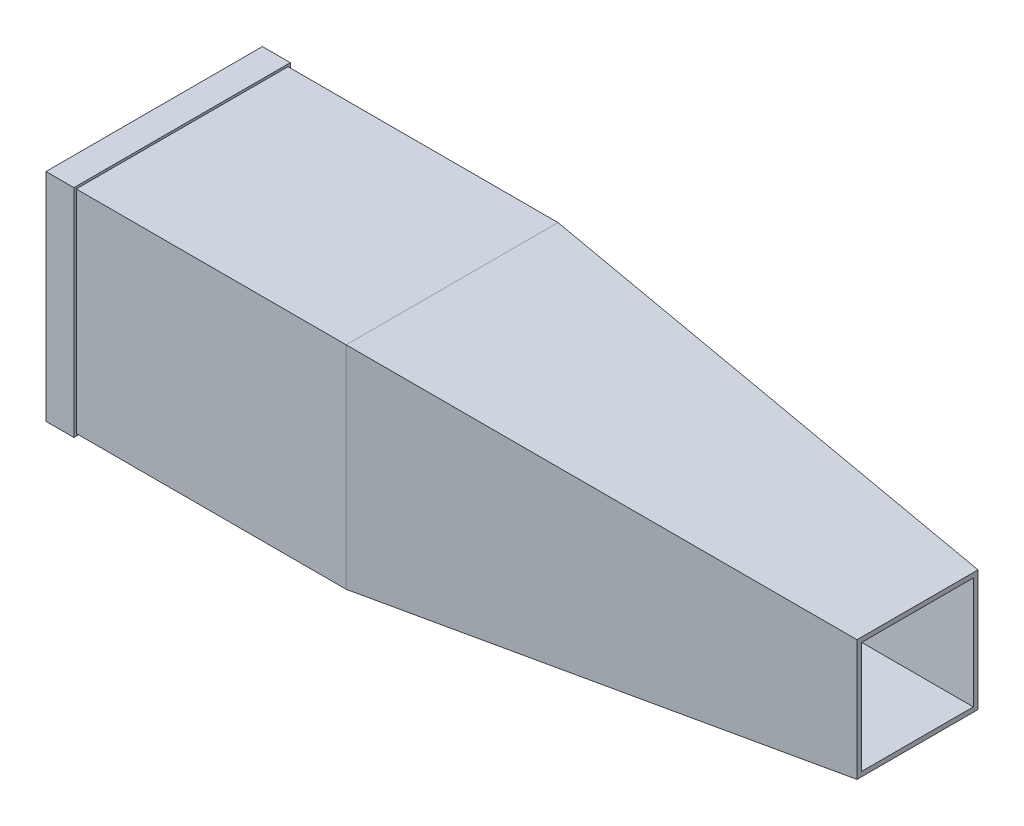
ISO-10303-21;
HEADER;
FILE_DESCRIPTION(('STEP AP214'),'2;1');
FILE_NAME('part.step','',(''),(''),'','','');
FILE_SCHEMA(('AUTOMOTIVE_DESIGN { 1 0 10303 214 1 1 1 1 }'));
ENDSEC;
DATA;
#1=APPLICATION_CONTEXT('core data for automotive mechanical design processes');
#2=APPLICATION_PROTOCOL_DEFINITION('international standard','automotive_design',2000,#1);
#3=PRODUCT_CONTEXT('',#1,'mechanical');
#4=PRODUCT('Part','Part','',(#3));
#5=PRODUCT_RELATED_PRODUCT_CATEGORY('part','',(#4));
#6=PRODUCT_DEFINITION_FORMATION('','',#4);
#7=PRODUCT_DEFINITION_CONTEXT('part definition',#1,'design');
#8=PRODUCT_DEFINITION('design','',#6,#7);
#9=PRODUCT_DEFINITION_SHAPE('','',#8);
#10=(LENGTH_UNIT() NAMED_UNIT(*) SI_UNIT(.MILLI.,.METRE.));
#11=(NAMED_UNIT(*) PLANE_ANGLE_UNIT() SI_UNIT($,.RADIAN.));
#12=(NAMED_UNIT(*) SI_UNIT($,.STERADIAN.) SOLID_ANGLE_UNIT());
#13=UNCERTAINTY_MEASURE_WITH_UNIT(LENGTH_MEASURE(1.E-05),#10,'distance_accuracy_value','');
#14=(GEOMETRIC_REPRESENTATION_CONTEXT(3) GLOBAL_UNCERTAINTY_ASSIGNED_CONTEXT((#13)) GLOBAL_UNIT_ASSIGNED_CONTEXT((#10,
#11,#12)) REPRESENTATION_CONTEXT('',''));
#15=CARTESIAN_POINT('',(0.,0.,0.));
#16=DIRECTION('',(0.,0.,1.));
#17=DIRECTION('',(1.,0.,0.));
#18=AXIS2_PLACEMENT_3D('',#15,#16,#17);
#19=CARTESIAN_POINT('',(320.,108.75,-108.75));
#20=DIRECTION('',(0.,0.,1.));
#21=DIRECTION('',(1.,0.,0.));
#22=AXIS2_PLACEMENT_3D('',#19,#20,#21);
#23=PLANE('',#22);
#24=DIRECTION('',(-1.,0.,0.));
#25=VECTOR('',#24,1.);
#26=CARTESIAN_POINT('',(320.,108.75,-108.75));
#27=LINE('',#26,#25);
#28=CARTESIAN_POINT('',(320.,108.75,-108.75));
#29=VERTEX_POINT('',#28);
#30=CARTESIAN_POINT('',(167.,108.75,-108.75));
#31=VERTEX_POINT('',#30);
#32=EDGE_CURVE('E334',#29,#31,#27,.T.);
#33=ORIENTED_EDGE('',*,*,#32,.T.);
#34=DIRECTION('',(0.,1.,0.));
#35=VECTOR('',#34,1.);
#36=CARTESIAN_POINT('',(167.,108.75,-108.75));
#37=LINE('',#36,#35);
#38=CARTESIAN_POINT('',(167.,-108.75,-108.75));
#39=VERTEX_POINT('',#38);
#40=EDGE_CURVE('E381',#39,#31,#37,.T.);
#41=ORIENTED_EDGE('',*,*,#40,.F.);
#42=DIRECTION('',(-1.,0.,0.));
#43=VECTOR('',#42,1.);
#44=CARTESIAN_POINT('',(320.,-108.75,-108.75));
#45=LINE('',#44,#43);
#46=CARTESIAN_POINT('',(320.,-108.75,-108.75));
#47=VERTEX_POINT('',#46);
#48=EDGE_CURVE('E275',#47,#39,#45,.T.);
#49=ORIENTED_EDGE('',*,*,#48,.F.);
#50=CARTESIAN_POINT('',(320.,-108.75,-108.75));
#51=DIRECTION('',(0.,1.,0.));
#52=VECTOR('',#51,1.);
#53=LINE('',#50,#52);
#54=EDGE_CURVE('E351',#47,#29,#53,.T.);
#55=ORIENTED_EDGE('',*,*,#54,.T.);
#56=EDGE_LOOP('',(#33,#41,#49,#55));
#57=FACE_BOUND('',#56,.T.);
#58=ADVANCED_FACE('F63',(#57),#23,.T.);
#59=CARTESIAN_POINT('',(320.,108.75,108.75));
#60=DIRECTION('',(0.,-1.,0.));
#61=DIRECTION('',(0.,0.,-1.));
#62=AXIS2_PLACEMENT_3D('',#59,#60,#61);
#63=PLANE('',#62);
#64=DIRECTION('',(-1.,0.,0.));
#65=VECTOR('',#64,1.);
#66=CARTESIAN_POINT('',(320.,108.75,108.75));
#67=LINE('',#66,#65);
#68=CARTESIAN_POINT('',(320.,108.75,108.75));
#69=VERTEX_POINT('',#68);
#70=CARTESIAN_POINT('',(167.,108.75,108.75));
#71=VERTEX_POINT('',#70);
#72=EDGE_CURVE('E724',#69,#71,#67,.T.);
#73=ORIENTED_EDGE('',*,*,#72,.T.);
#74=DIRECTION('',(0.,0.,1.));
#75=VECTOR('',#74,1.);
#76=CARTESIAN_POINT('',(167.,108.75,-108.75));
#77=LINE('',#76,#75);
#78=EDGE_CURVE('E384',#31,#71,#77,.T.);
#79=ORIENTED_EDGE('',*,*,#78,.F.);
#80=ORIENTED_EDGE('',*,*,#32,.F.);
#81=CARTESIAN_POINT('',(320.,108.75,-108.75));
#82=DIRECTION('',(0.,0.,1.));
#83=VECTOR('',#82,1.);
#84=LINE('',#81,#83);
#85=EDGE_CURVE('E905',#29,#69,#84,.T.);
#86=ORIENTED_EDGE('',*,*,#85,.T.);
#87=EDGE_LOOP('',(#73,#79,#80,#86));
#88=FACE_BOUND('',#87,.T.);
#89=ADVANCED_FACE('F324',(#88),#63,.T.);
#90=CARTESIAN_POINT('',(320.,108.75,108.75));
#91=DIRECTION('',(0.,0.,-1.));
#92=DIRECTION('',(-1.,0.,0.));
#93=AXIS2_PLACEMENT_3D('',#90,#91,#92);
#94=PLANE('',#93);
#95=DIRECTION('',(-1.,0.,0.));
#96=VECTOR('',#95,1.);
#97=CARTESIAN_POINT('',(320.,-108.75,108.75));
#98=LINE('',#97,#96);
#99=CARTESIAN_POINT('',(320.,-108.75,108.75));
#100=VERTEX_POINT('',#99);
#101=CARTESIAN_POINT('',(167.,-108.75,108.75));
#102=VERTEX_POINT('',#101);
#103=EDGE_CURVE('E274',#100,#102,#98,.T.);
#104=ORIENTED_EDGE('',*,*,#103,.T.);
#105=DIRECTION('',(0.,-1.,0.));
#106=VECTOR('',#105,1.);
#107=CARTESIAN_POINT('',(167.,108.75,108.75));
#108=LINE('',#107,#106);
#109=EDGE_CURVE('E90',#71,#102,#108,.T.);
#110=ORIENTED_EDGE('',*,*,#109,.F.);
#111=ORIENTED_EDGE('',*,*,#72,.F.);
#112=CARTESIAN_POINT('',(320.,108.75,108.75));
#113=DIRECTION('',(0.,-1.,0.));
#114=VECTOR('',#113,1.);
#115=LINE('',#112,#114);
#116=EDGE_CURVE('E299',#69,#100,#115,.T.);
#117=ORIENTED_EDGE('',*,*,#116,.T.);
#118=EDGE_LOOP('',(#104,#110,#111,#117));
#119=FACE_BOUND('',#118,.T.);
#120=ADVANCED_FACE('F316',(#119),#94,.T.);
#121=CARTESIAN_POINT('',(320.,-108.75,108.75));
#122=DIRECTION('',(0.,1.,0.));
#123=DIRECTION('',(0.,0.,1.));
#124=AXIS2_PLACEMENT_3D('',#121,#122,#123);
#125=PLANE('',#124);
#126=ORIENTED_EDGE('',*,*,#48,.T.);
#127=DIRECTION('',(0.,0.,-1.));
#128=VECTOR('',#127,1.);
#129=CARTESIAN_POINT('',(167.,-108.75,-108.75));
#130=LINE('',#129,#128);
#131=EDGE_CURVE('E385',#102,#39,#130,.T.);
#132=ORIENTED_EDGE('',*,*,#131,.F.);
#133=ORIENTED_EDGE('',*,*,#103,.F.);
#134=CARTESIAN_POINT('',(320.,-108.75,108.75));
#135=DIRECTION('',(0.,0.,-1.));
#136=VECTOR('',#135,1.);
#137=LINE('',#134,#136);
#138=EDGE_CURVE('E367',#100,#47,#137,.T.);
#139=ORIENTED_EDGE('',*,*,#138,.T.);
#140=EDGE_LOOP('',(#126,#132,#133,#139));
#141=FACE_BOUND('',#140,.T.);
#142=ADVANCED_FACE('F375',(#141),#125,.T.);
#143=CARTESIAN_POINT('',(30.,0.,0.));
#144=DIRECTION('',(1.,0.,0.));
#145=DIRECTION('',(0.,0.,-1.));
#146=AXIS2_PLACEMENT_3D('',#143,#144,#145);
#147=PLANE('',#146);
#148=DIRECTION('',(0.,1.,0.));
#149=VECTOR('',#148,1.);
#150=CARTESIAN_POINT('',(30.,116.25,-116.25));
#151=LINE('',#150,#149);
#152=CARTESIAN_POINT('',(30.,-116.25,-116.25));
#153=VERTEX_POINT('',#152);
#154=CARTESIAN_POINT('',(30.,116.25,-116.25));
#155=VERTEX_POINT('',#154);
#156=EDGE_CURVE('E639',#153,#155,#151,.T.);
#157=ORIENTED_EDGE('',*,*,#156,.T.);
#158=DIRECTION('',(0.,0.,1.));
#159=VECTOR('',#158,1.);
#160=CARTESIAN_POINT('',(30.,116.25,116.25));
#161=LINE('',#160,#159);
#162=CARTESIAN_POINT('',(30.,116.25,116.25));
#163=VERTEX_POINT('',#162);
#164=EDGE_CURVE('E643',#155,#163,#161,.T.);
#165=ORIENTED_EDGE('',*,*,#164,.T.);
#166=DIRECTION('',(0.,-1.,0.));
#167=VECTOR('',#166,1.);
#168=CARTESIAN_POINT('',(30.,116.25,116.25));
#169=LINE('',#168,#167);
#170=CARTESIAN_POINT('',(30.,-116.25,116.25));
#171=VERTEX_POINT('',#170);
#172=EDGE_CURVE('E647',#163,#171,#169,.T.);
#173=ORIENTED_EDGE('',*,*,#172,.T.);
#174=DIRECTION('',(0.,0.,-1.));
#175=VECTOR('',#174,1.);
#176=CARTESIAN_POINT('',(30.,-116.25,116.25));
#177=LINE('',#176,#175);
#178=EDGE_CURVE('E650',#171,#153,#177,.T.);
#179=ORIENTED_EDGE('',*,*,#178,.T.);
#180=EDGE_LOOP('',(#157,#165,#173,#179));
#181=FACE_BOUND('',#180,.T.);
#182=DIRECTION('',(0.,0.,-1.));
#183=VECTOR('',#182,1.);
#184=CARTESIAN_POINT('',(30.,113.75,0.));
#185=LINE('',#184,#183);
#186=CARTESIAN_POINT('',(30.,113.75,113.75));
#187=VERTEX_POINT('',#186);
#188=CARTESIAN_POINT('',(30.,113.75,-113.75));
#189=VERTEX_POINT('',#188);
#190=EDGE_CURVE('E74',#187,#189,#185,.T.);
#191=ORIENTED_EDGE('',*,*,#190,.T.);
#192=DIRECTION('',(0.,-1.,0.));
#193=VECTOR('',#192,1.);
#194=CARTESIAN_POINT('',(30.,0.,-113.75));
#195=LINE('',#194,#193);
#196=CARTESIAN_POINT('',(30.,-113.75,-113.75));
#197=VERTEX_POINT('',#196);
#198=EDGE_CURVE('E12',#189,#197,#195,.T.);
#199=ORIENTED_EDGE('',*,*,#198,.T.);
#200=DIRECTION('',(0.,0.,1.));
#201=VECTOR('',#200,1.);
#202=CARTESIAN_POINT('',(30.,-113.75,0.));
#203=LINE('',#202,#201);
#204=CARTESIAN_POINT('',(30.,-113.75,113.75));
#205=VERTEX_POINT('',#204);
#206=EDGE_CURVE('E684',#197,#205,#203,.T.);
#207=ORIENTED_EDGE('',*,*,#206,.T.);
#208=DIRECTION('',(0.,1.,0.));
#209=VECTOR('',#208,1.);
#210=CARTESIAN_POINT('',(30.,0.,113.75));
#211=LINE('',#210,#209);
#212=EDGE_CURVE('E688',#205,#187,#211,.T.);
#213=ORIENTED_EDGE('',*,*,#212,.T.);
#214=EDGE_LOOP('',(#191,#199,#207,#213));
#215=FACE_BOUND('',#214,.T.);
#216=ADVANCED_FACE('F834',(#181,#215),#147,.T.);
#217=CARTESIAN_POINT('',(0.,0.,0.));
#218=DIRECTION('',(1.,0.,0.));
#219=DIRECTION('',(0.,0.,-1.));
#220=AXIS2_PLACEMENT_3D('',#217,#218,#219);
#221=PLANE('',#220);
#222=DIRECTION('',(0.,1.,0.));
#223=VECTOR('',#222,1.);
#224=CARTESIAN_POINT('',(0.,116.25,-116.25));
#225=LINE('',#224,#223);
#226=CARTESIAN_POINT('',(0.,-116.25,-116.25));
#227=VERTEX_POINT('',#226);
#228=CARTESIAN_POINT('',(0.,116.25,-116.25));
#229=VERTEX_POINT('',#228);
#230=EDGE_CURVE('E638',#227,#229,#225,.T.);
#231=ORIENTED_EDGE('',*,*,#230,.F.);
#232=DIRECTION('',(0.,0.,-1.));
#233=VECTOR('',#232,1.);
#234=CARTESIAN_POINT('',(0.,-116.25,116.25));
#235=LINE('',#234,#233);
#236=CARTESIAN_POINT('',(0.,-116.25,116.25));
#237=VERTEX_POINT('',#236);
#238=EDGE_CURVE('E644',#237,#227,#235,.T.);
#239=ORIENTED_EDGE('',*,*,#238,.F.);
#240=DIRECTION('',(0.,-1.,0.));
#241=VECTOR('',#240,1.);
#242=CARTESIAN_POINT('',(0.,116.25,116.25));
#243=LINE('',#242,#241);
#244=CARTESIAN_POINT('',(0.,116.25,116.25));
#245=VERTEX_POINT('',#244);
#246=EDGE_CURVE('E660',#245,#237,#243,.T.);
#247=ORIENTED_EDGE('',*,*,#246,.F.);
#248=DIRECTION('',(0.,0.,1.));
#249=VECTOR('',#248,1.);
#250=CARTESIAN_POINT('',(0.,116.25,116.25));
#251=LINE('',#250,#249);
#252=EDGE_CURVE('E657',#229,#245,#251,.T.);
#253=ORIENTED_EDGE('',*,*,#252,.F.);
#254=EDGE_LOOP('',(#231,#239,#247,#253));
#255=FACE_BOUND('',#254,.T.);
#256=DIRECTION('',(0.,1.,0.));
#257=VECTOR('',#256,1.);
#258=CARTESIAN_POINT('',(0.,111.25,-111.25));
#259=LINE('',#258,#257);
#260=CARTESIAN_POINT('',(0.,-111.25,-111.25));
#261=VERTEX_POINT('',#260);
#262=CARTESIAN_POINT('',(0.,111.25,-111.25));
#263=VERTEX_POINT('',#262);
#264=EDGE_CURVE('E610',#261,#263,#259,.T.);
#265=ORIENTED_EDGE('',*,*,#264,.T.);
#266=DIRECTION('',(0.,0.,1.));
#267=VECTOR('',#266,1.);
#268=CARTESIAN_POINT('',(0.,111.25,111.25));
#269=LINE('',#268,#267);
#270=CARTESIAN_POINT('',(0.,111.25,111.25));
#271=VERTEX_POINT('',#270);
#272=EDGE_CURVE('E614',#263,#271,#269,.T.);
#273=ORIENTED_EDGE('',*,*,#272,.T.);
#274=DIRECTION('',(0.,-1.,0.));
#275=VECTOR('',#274,1.);
#276=CARTESIAN_POINT('',(0.,111.25,111.25));
#277=LINE('',#276,#275);
#278=CARTESIAN_POINT('',(0.,-111.25,111.25));
#279=VERTEX_POINT('',#278);
#280=EDGE_CURVE('E618',#271,#279,#277,.T.);
#281=ORIENTED_EDGE('',*,*,#280,.T.);
#282=DIRECTION('',(0.,0.,-1.));
#283=VECTOR('',#282,1.);
#284=CARTESIAN_POINT('',(0.,-111.25,111.25));
#285=LINE('',#284,#283);
#286=EDGE_CURVE('E622',#279,#261,#285,.T.);
#287=ORIENTED_EDGE('',*,*,#286,.T.);
#288=EDGE_LOOP('',(#265,#273,#281,#287));
#289=FACE_BOUND('',#288,.T.);
#290=ADVANCED_FACE('F837',(#255,#289),#221,.F.);
#291=CARTESIAN_POINT('',(30.,116.25,-116.25));
#292=DIRECTION('',(0.,0.,1.));
#293=DIRECTION('',(1.,0.,0.));
#294=AXIS2_PLACEMENT_3D('',#291,#292,#293);
#295=PLANE('',#294);
#296=ORIENTED_EDGE('',*,*,#230,.T.);
#297=DIRECTION('',(-1.,0.,0.));
#298=VECTOR('',#297,1.);
#299=CARTESIAN_POINT('',(30.,116.25,-116.25));
#300=LINE('',#299,#298);
#301=EDGE_CURVE('E676',#155,#229,#300,.T.);
#302=ORIENTED_EDGE('',*,*,#301,.F.);
#303=ORIENTED_EDGE('',*,*,#156,.F.);
#304=DIRECTION('',(-1.,0.,0.));
#305=VECTOR('',#304,1.);
#306=CARTESIAN_POINT('',(30.,-116.25,-116.25));
#307=LINE('',#306,#305);
#308=EDGE_CURVE('E653',#153,#227,#307,.T.);
#309=ORIENTED_EDGE('',*,*,#308,.T.);
#310=EDGE_LOOP('',(#296,#302,#303,#309));
#311=FACE_BOUND('',#310,.T.);
#312=ADVANCED_FACE('F65',(#311),#295,.F.);
#313=CARTESIAN_POINT('',(30.,116.25,116.25));
#314=DIRECTION('',(0.,-1.,0.));
#315=DIRECTION('',(0.,0.,-1.));
#316=AXIS2_PLACEMENT_3D('',#313,#314,#315);
#317=PLANE('',#316);
#318=ORIENTED_EDGE('',*,*,#252,.T.);
#319=DIRECTION('',(-1.,0.,0.));
#320=VECTOR('',#319,1.);
#321=CARTESIAN_POINT('',(30.,116.25,116.25));
#322=LINE('',#321,#320);
#323=EDGE_CURVE('E672',#163,#245,#322,.T.);
#324=ORIENTED_EDGE('',*,*,#323,.F.);
#325=ORIENTED_EDGE('',*,*,#164,.F.);
#326=ORIENTED_EDGE('',*,*,#301,.T.);
#327=EDGE_LOOP('',(#318,#324,#325,#326));
#328=FACE_BOUND('',#327,.T.);
#329=ADVANCED_FACE('F847',(#328),#317,.F.);
#330=CARTESIAN_POINT('',(30.,116.25,116.25));
#331=DIRECTION('',(0.,0.,-1.));
#332=DIRECTION('',(-1.,0.,0.));
#333=AXIS2_PLACEMENT_3D('',#330,#331,#332);
#334=PLANE('',#333);
#335=ORIENTED_EDGE('',*,*,#246,.T.);
#336=DIRECTION('',(-1.,0.,0.));
#337=VECTOR('',#336,1.);
#338=CARTESIAN_POINT('',(30.,-116.25,116.25));
#339=LINE('',#338,#337);
#340=EDGE_CURVE('E668',#171,#237,#339,.T.);
#341=ORIENTED_EDGE('',*,*,#340,.F.);
#342=ORIENTED_EDGE('',*,*,#172,.F.);
#343=ORIENTED_EDGE('',*,*,#323,.T.);
#344=EDGE_LOOP('',(#335,#341,#342,#343));
#345=FACE_BOUND('',#344,.T.);
#346=ADVANCED_FACE('F844',(#345),#334,.F.);
#347=CARTESIAN_POINT('',(30.,-116.25,116.25));
#348=DIRECTION('',(0.,1.,0.));
#349=DIRECTION('',(0.,0.,1.));
#350=AXIS2_PLACEMENT_3D('',#347,#348,#349);
#351=PLANE('',#350);
#352=ORIENTED_EDGE('',*,*,#238,.T.);
#353=ORIENTED_EDGE('',*,*,#308,.F.);
#354=ORIENTED_EDGE('',*,*,#178,.F.);
#355=ORIENTED_EDGE('',*,*,#340,.T.);
#356=EDGE_LOOP('',(#352,#353,#354,#355));
#357=FACE_BOUND('',#356,.T.);
#358=ADVANCED_FACE('F832',(#357),#351,.F.);
#359=CARTESIAN_POINT('',(30.,111.25,-111.25));
#360=DIRECTION('',(0.,0.,1.));
#361=DIRECTION('',(1.,0.,0.));
#362=AXIS2_PLACEMENT_3D('',#359,#360,#361);
#363=PLANE('',#362);
#364=DIRECTION('',(0.,-1.,0.));
#365=VECTOR('',#364,1.);
#366=CARTESIAN_POINT('',(20.,111.25,-111.25));
#367=LINE('',#366,#365);
#368=CARTESIAN_POINT('',(20.,111.25,-111.25));
#369=VERTEX_POINT('',#368);
#370=CARTESIAN_POINT('',(20.,-111.25,-111.25));
#371=VERTEX_POINT('',#370);
#372=EDGE_CURVE('E606',#369,#371,#367,.T.);
#373=ORIENTED_EDGE('',*,*,#372,.F.);
#374=DIRECTION('',(-1.,0.,0.));
#375=VECTOR('',#374,1.);
#376=CARTESIAN_POINT('',(30.,111.25,-111.25));
#377=LINE('',#376,#375);
#378=EDGE_CURVE('E635',#369,#263,#377,.T.);
#379=ORIENTED_EDGE('',*,*,#378,.T.);
#380=ORIENTED_EDGE('',*,*,#264,.F.);
#381=DIRECTION('',(-1.,0.,0.));
#382=VECTOR('',#381,1.);
#383=CARTESIAN_POINT('',(30.,-111.25,-111.25));
#384=LINE('',#383,#382);
#385=EDGE_CURVE('E626',#371,#261,#384,.T.);
#386=ORIENTED_EDGE('',*,*,#385,.F.);
#387=EDGE_LOOP('',(#373,#379,#380,#386));
#388=FACE_BOUND('',#387,.T.);
#389=ADVANCED_FACE('F828',(#388),#363,.T.);
#390=CARTESIAN_POINT('',(30.,111.25,111.25));
#391=DIRECTION('',(0.,-1.,0.));
#392=DIRECTION('',(0.,0.,-1.));
#393=AXIS2_PLACEMENT_3D('',#390,#391,#392);
#394=PLANE('',#393);
#395=DIRECTION('',(0.,0.,-1.));
#396=VECTOR('',#395,1.);
#397=CARTESIAN_POINT('',(20.,111.25,111.25));
#398=LINE('',#397,#396);
#399=CARTESIAN_POINT('',(20.,111.25,111.25));
#400=VERTEX_POINT('',#399);
#401=EDGE_CURVE('E601',#400,#369,#398,.T.);
#402=ORIENTED_EDGE('',*,*,#401,.F.);
#403=DIRECTION('',(-1.,0.,0.));
#404=VECTOR('',#403,1.);
#405=CARTESIAN_POINT('',(30.,111.25,111.25));
#406=LINE('',#405,#404);
#407=EDGE_CURVE('E632',#400,#271,#406,.T.);
#408=ORIENTED_EDGE('',*,*,#407,.T.);
#409=ORIENTED_EDGE('',*,*,#272,.F.);
#410=ORIENTED_EDGE('',*,*,#378,.F.);
#411=EDGE_LOOP('',(#402,#408,#409,#410));
#412=FACE_BOUND('',#411,.T.);
#413=ADVANCED_FACE('F824',(#412),#394,.T.);
#414=CARTESIAN_POINT('',(30.,111.25,111.25));
#415=DIRECTION('',(0.,0.,-1.));
#416=DIRECTION('',(-1.,0.,0.));
#417=AXIS2_PLACEMENT_3D('',#414,#415,#416);
#418=PLANE('',#417);
#419=DIRECTION('',(0.,1.,0.));
#420=VECTOR('',#419,1.);
#421=CARTESIAN_POINT('',(20.,111.25,111.25));
#422=LINE('',#421,#420);
#423=CARTESIAN_POINT('',(20.,-111.25,111.25));
#424=VERTEX_POINT('',#423);
#425=EDGE_CURVE('E597',#424,#400,#422,.T.);
#426=ORIENTED_EDGE('',*,*,#425,.F.);
#427=DIRECTION('',(-1.,0.,0.));
#428=VECTOR('',#427,1.);
#429=CARTESIAN_POINT('',(30.,-111.25,111.25));
#430=LINE('',#429,#428);
#431=EDGE_CURVE('E629',#424,#279,#430,.T.);
#432=ORIENTED_EDGE('',*,*,#431,.T.);
#433=ORIENTED_EDGE('',*,*,#280,.F.);
#434=ORIENTED_EDGE('',*,*,#407,.F.);
#435=EDGE_LOOP('',(#426,#432,#433,#434));
#436=FACE_BOUND('',#435,.T.);
#437=ADVANCED_FACE('F820',(#436),#418,.T.);
#438=CARTESIAN_POINT('',(30.,-111.25,111.25));
#439=DIRECTION('',(0.,1.,0.));
#440=DIRECTION('',(0.,0.,1.));
#441=AXIS2_PLACEMENT_3D('',#438,#439,#440);
#442=PLANE('',#441);
#443=DIRECTION('',(0.,0.,1.));
#444=VECTOR('',#443,1.);
#445=CARTESIAN_POINT('',(20.,-111.25,111.25));
#446=LINE('',#445,#444);
#447=EDGE_CURVE('E680',#371,#424,#446,.T.);
#448=ORIENTED_EDGE('',*,*,#447,.F.);
#449=ORIENTED_EDGE('',*,*,#385,.T.);
#450=ORIENTED_EDGE('',*,*,#286,.F.);
#451=ORIENTED_EDGE('',*,*,#431,.F.);
#452=EDGE_LOOP('',(#448,#449,#450,#451));
#453=FACE_BOUND('',#452,.T.);
#454=ADVANCED_FACE('F817',(#453),#442,.T.);
#455=CARTESIAN_POINT('',(20.,0.,0.));
#456=DIRECTION('',(-1.,0.,0.));
#457=DIRECTION('',(0.,0.,1.));
#458=AXIS2_PLACEMENT_3D('',#455,#456,#457);
#459=PLANE('',#458);
#460=ORIENTED_EDGE('',*,*,#401,.T.);
#461=ORIENTED_EDGE('',*,*,#372,.T.);
#462=ORIENTED_EDGE('',*,*,#447,.T.);
#463=ORIENTED_EDGE('',*,*,#425,.T.);
#464=EDGE_LOOP('',(#460,#461,#462,#463));
#465=FACE_BOUND('',#464,.T.);
#466=DIRECTION('',(0.,0.,-1.));
#467=VECTOR('',#466,1.);
#468=CARTESIAN_POINT('',(20.,-108.75,108.75));
#469=LINE('',#468,#467);
#470=CARTESIAN_POINT('',(20.,-108.75,108.75));
#471=VERTEX_POINT('',#470);
#472=CARTESIAN_POINT('',(20.,-108.75,-108.75));
#473=VERTEX_POINT('',#472);
#474=EDGE_CURVE('E271',#471,#473,#469,.T.);
#475=ORIENTED_EDGE('',*,*,#474,.T.);
#476=DIRECTION('',(0.,1.,0.));
#477=VECTOR('',#476,1.);
#478=CARTESIAN_POINT('',(20.,108.75,-108.75));
#479=LINE('',#478,#477);
#480=CARTESIAN_POINT('',(20.,108.75,-108.75));
#481=VERTEX_POINT('',#480);
#482=EDGE_CURVE('E535',#473,#481,#479,.T.);
#483=ORIENTED_EDGE('',*,*,#482,.T.);
#484=DIRECTION('',(0.,0.,1.));
#485=VECTOR('',#484,1.);
#486=CARTESIAN_POINT('',(20.,108.75,108.75));
#487=LINE('',#486,#485);
#488=CARTESIAN_POINT('',(20.,108.75,108.75));
#489=VERTEX_POINT('',#488);
#490=EDGE_CURVE('E588',#481,#489,#487,.T.);
#491=ORIENTED_EDGE('',*,*,#490,.T.);
#492=DIRECTION('',(0.,-1.,0.));
#493=VECTOR('',#492,1.);
#494=CARTESIAN_POINT('',(20.,108.75,108.75));
#495=LINE('',#494,#493);
#496=EDGE_CURVE('E592',#489,#471,#495,.T.);
#497=ORIENTED_EDGE('',*,*,#496,.T.);
#498=EDGE_LOOP('',(#475,#483,#491,#497));
#499=FACE_BOUND('',#498,.T.);
#500=ADVANCED_FACE('F734',(#465,#499),#459,.T.);
#501=CARTESIAN_POINT('',(320.,-113.75,-113.75));
#502=DIRECTION('',(0.,0.,1.));
#503=DIRECTION('',(1.,0.,0.));
#504=AXIS2_PLACEMENT_3D('',#501,#502,#503);
#505=PLANE('',#504);
#506=ORIENTED_EDGE('',*,*,#198,.F.);
#507=DIRECTION('',(-1.,0.,0.));
#508=VECTOR('',#507,1.);
#509=CARTESIAN_POINT('',(320.,113.75,-113.75));
#510=LINE('',#509,#508);
#511=CARTESIAN_POINT('',(320.,113.75,-113.75));
#512=VERTEX_POINT('',#511);
#513=EDGE_CURVE('E602',#512,#189,#510,.T.);
#514=ORIENTED_EDGE('',*,*,#513,.F.);
#515=DIRECTION('',(0.,1.,0.));
#516=VECTOR('',#515,1.);
#517=CARTESIAN_POINT('',(320.,0.,-113.75));
#518=LINE('',#517,#516);
#519=CARTESIAN_POINT('',(320.,-113.75,-113.75));
#520=VERTEX_POINT('',#519);
#521=EDGE_CURVE('E342',#520,#512,#518,.T.);
#522=ORIENTED_EDGE('',*,*,#521,.F.);
#523=DIRECTION('',(-1.,0.,0.));
#524=VECTOR('',#523,1.);
#525=CARTESIAN_POINT('',(320.,-113.75,-113.75));
#526=LINE('',#525,#524);
#527=EDGE_CURVE('E695',#520,#197,#526,.T.);
#528=ORIENTED_EDGE('',*,*,#527,.T.);
#529=EDGE_LOOP('',(#506,#514,#522,#528));
#530=FACE_BOUND('',#529,.T.);
#531=ADVANCED_FACE('F812',(#530),#505,.F.);
#532=CARTESIAN_POINT('',(320.,113.75,113.75));
#533=DIRECTION('',(0.,-1.,0.));
#534=DIRECTION('',(0.,0.,-1.));
#535=AXIS2_PLACEMENT_3D('',#532,#533,#534);
#536=PLANE('',#535);
#537=ORIENTED_EDGE('',*,*,#190,.F.);
#538=DIRECTION('',(-1.,0.,0.));
#539=VECTOR('',#538,1.);
#540=CARTESIAN_POINT('',(320.,113.75,113.75));
#541=LINE('',#540,#539);
#542=CARTESIAN_POINT('',(320.,113.75,113.75));
#543=VERTEX_POINT('',#542);
#544=EDGE_CURVE('E703',#543,#187,#541,.T.);
#545=ORIENTED_EDGE('',*,*,#544,.F.);
#546=DIRECTION('',(0.,0.,1.));
#547=VECTOR('',#546,1.);
#548=CARTESIAN_POINT('',(320.,113.75,0.));
#549=LINE('',#548,#547);
#550=EDGE_CURVE('E713',#512,#543,#549,.T.);
#551=ORIENTED_EDGE('',*,*,#550,.F.);
#552=ORIENTED_EDGE('',*,*,#513,.T.);
#553=EDGE_LOOP('',(#537,#545,#551,#552));
#554=FACE_BOUND('',#553,.T.);
#555=ADVANCED_FACE('F806',(#554),#536,.F.);
#556=CARTESIAN_POINT('',(320.,-113.75,113.75));
#557=DIRECTION('',(0.,0.,-1.));
#558=DIRECTION('',(-1.,0.,0.));
#559=AXIS2_PLACEMENT_3D('',#556,#557,#558);
#560=PLANE('',#559);
#561=ORIENTED_EDGE('',*,*,#212,.F.);
#562=DIRECTION('',(-1.,0.,0.));
#563=VECTOR('',#562,1.);
#564=CARTESIAN_POINT('',(320.,-113.75,113.75));
#565=LINE('',#564,#563);
#566=CARTESIAN_POINT('',(320.,-113.75,113.75));
#567=VERTEX_POINT('',#566);
#568=EDGE_CURVE('E699',#567,#205,#565,.T.);
#569=ORIENTED_EDGE('',*,*,#568,.F.);
#570=DIRECTION('',(0.,1.,0.));
#571=VECTOR('',#570,1.);
#572=CARTESIAN_POINT('',(320.,0.,113.75));
#573=LINE('',#572,#571);
#574=EDGE_CURVE('E717',#543,#567,#573,.F.);
#575=ORIENTED_EDGE('',*,*,#574,.F.);
#576=ORIENTED_EDGE('',*,*,#544,.T.);
#577=EDGE_LOOP('',(#561,#569,#575,#576));
#578=FACE_BOUND('',#577,.T.);
#579=ADVANCED_FACE('F800',(#578),#560,.F.);
#580=CARTESIAN_POINT('',(320.,-113.75,113.75));
#581=DIRECTION('',(0.,1.,0.));
#582=DIRECTION('',(0.,0.,1.));
#583=AXIS2_PLACEMENT_3D('',#580,#581,#582);
#584=PLANE('',#583);
#585=ORIENTED_EDGE('',*,*,#206,.F.);
#586=ORIENTED_EDGE('',*,*,#527,.F.);
#587=DIRECTION('',(0.,0.,1.));
#588=VECTOR('',#587,1.);
#589=CARTESIAN_POINT('',(320.,-113.75,0.));
#590=LINE('',#589,#588);
#591=EDGE_CURVE('E700',#567,#520,#590,.F.);
#592=ORIENTED_EDGE('',*,*,#591,.F.);
#593=ORIENTED_EDGE('',*,*,#568,.T.);
#594=EDGE_LOOP('',(#585,#586,#592,#593));
#595=FACE_BOUND('',#594,.T.);
#596=ADVANCED_FACE('F795',(#595),#584,.F.);
#597=DIRECTION('',(0.,1.,0.));
#598=VECTOR('',#597,1.);
#599=CARTESIAN_POINT('',(163.,108.75,-108.75));
#600=LINE('',#599,#598);
#601=CARTESIAN_POINT('',(163.,-108.75,-108.75));
#602=VERTEX_POINT('',#601);
#603=CARTESIAN_POINT('',(163.,108.75,-108.75));
#604=VERTEX_POINT('',#603);
#605=EDGE_CURVE('E82',#602,#604,#600,.T.);
#606=ORIENTED_EDGE('',*,*,#605,.T.);
#607=EDGE_CURVE('E67',#604,#481,#27,.T.);
#608=ORIENTED_EDGE('',*,*,#607,.T.);
#609=ORIENTED_EDGE('',*,*,#482,.F.);
#610=EDGE_CURVE('E282',#602,#473,#45,.T.);
#611=ORIENTED_EDGE('',*,*,#610,.F.);
#612=EDGE_LOOP('',(#606,#608,#609,#611));
#613=FACE_BOUND('',#612,.T.);
#614=ADVANCED_FACE('F322',(#613),#23,.T.);
#615=DIRECTION('',(0.,0.,1.));
#616=VECTOR('',#615,1.);
#617=CARTESIAN_POINT('',(163.,108.75,-108.75));
#618=LINE('',#617,#616);
#619=CARTESIAN_POINT('',(163.,108.75,108.75));
#620=VERTEX_POINT('',#619);
#621=EDGE_CURVE('E732',#604,#620,#618,.T.);
#622=ORIENTED_EDGE('',*,*,#621,.T.);
#623=EDGE_CURVE('E266',#620,#489,#67,.T.);
#624=ORIENTED_EDGE('',*,*,#623,.T.);
#625=ORIENTED_EDGE('',*,*,#490,.F.);
#626=ORIENTED_EDGE('',*,*,#607,.F.);
#627=EDGE_LOOP('',(#622,#624,#625,#626));
#628=FACE_BOUND('',#627,.T.);
#629=ADVANCED_FACE('F315',(#628),#63,.T.);
#630=DIRECTION('',(0.,-1.,0.));
#631=VECTOR('',#630,1.);
#632=CARTESIAN_POINT('',(163.,108.75,108.75));
#633=LINE('',#632,#631);
#634=CARTESIAN_POINT('',(163.,-108.75,108.75));
#635=VERTEX_POINT('',#634);
#636=EDGE_CURVE('E253',#620,#635,#633,.T.);
#637=ORIENTED_EDGE('',*,*,#636,.T.);
#638=EDGE_CURVE('E264',#635,#471,#98,.T.);
#639=ORIENTED_EDGE('',*,*,#638,.T.);
#640=ORIENTED_EDGE('',*,*,#496,.F.);
#641=ORIENTED_EDGE('',*,*,#623,.F.);
#642=EDGE_LOOP('',(#637,#639,#640,#641));
#643=FACE_BOUND('',#642,.T.);
#644=ADVANCED_FACE('F262',(#643),#94,.T.);
#645=DIRECTION('',(0.,0.,-1.));
#646=VECTOR('',#645,1.);
#647=CARTESIAN_POINT('',(163.,-108.75,-108.75));
#648=LINE('',#647,#646);
#649=EDGE_CURVE('E249',#635,#602,#648,.T.);
#650=ORIENTED_EDGE('',*,*,#649,.T.);
#651=ORIENTED_EDGE('',*,*,#610,.T.);
#652=ORIENTED_EDGE('',*,*,#474,.F.);
#653=ORIENTED_EDGE('',*,*,#638,.F.);
#654=EDGE_LOOP('',(#650,#651,#652,#653));
#655=FACE_BOUND('',#654,.T.);
#656=ADVANCED_FACE('F269',(#655),#125,.T.);
#657=CARTESIAN_POINT('',(820.,0.,0.));
#658=DIRECTION('',(-1.,0.,0.));
#659=DIRECTION('',(0.,0.,1.));
#660=AXIS2_PLACEMENT_3D('',#657,#658,#659);
#661=PLANE('',#660);
#662=DIRECTION('',(0.,0.,1.));
#663=VECTOR('',#662,1.);
#664=CARTESIAN_POINT('',(820.,-60.,60.));
#665=LINE('',#664,#663);
#666=CARTESIAN_POINT('',(820.,-60.,-60.));
#667=VERTEX_POINT('',#666);
#668=CARTESIAN_POINT('',(820.,-60.,60.));
#669=VERTEX_POINT('',#668);
#670=EDGE_CURVE('E883',#667,#669,#665,.T.);
#671=ORIENTED_EDGE('',*,*,#670,.T.);
#672=DIRECTION('',(0.,1.,0.));
#673=VECTOR('',#672,1.);
#674=CARTESIAN_POINT('',(820.,60.,60.));
#675=LINE('',#674,#673);
#676=CARTESIAN_POINT('',(820.,60.,60.));
#677=VERTEX_POINT('',#676);
#678=EDGE_CURVE('E476',#669,#677,#675,.T.);
#679=ORIENTED_EDGE('',*,*,#678,.T.);
#680=DIRECTION('',(0.,0.,-1.));
#681=VECTOR('',#680,1.);
#682=CARTESIAN_POINT('',(820.,60.,60.));
#683=LINE('',#682,#681);
#684=CARTESIAN_POINT('',(820.,60.,-60.));
#685=VERTEX_POINT('',#684);
#686=EDGE_CURVE('E889',#677,#685,#683,.T.);
#687=ORIENTED_EDGE('',*,*,#686,.T.);
#688=DIRECTION('',(0.,-1.,0.));
#689=VECTOR('',#688,1.);
#690=CARTESIAN_POINT('',(820.,60.,-60.));
#691=LINE('',#690,#689);
#692=EDGE_CURVE('E304',#685,#667,#691,.T.);
#693=ORIENTED_EDGE('',*,*,#692,.T.);
#694=EDGE_LOOP('',(#671,#679,#687,#693));
#695=FACE_BOUND('',#694,.T.);
#696=DIRECTION('',(0.,0.,-1.));
#697=VECTOR('',#696,1.);
#698=CARTESIAN_POINT('',(820.,-65.,65.));
#699=LINE('',#698,#697);
#700=CARTESIAN_POINT('',(820.,-65.,65.));
#701=VERTEX_POINT('',#700);
#702=CARTESIAN_POINT('',(820.,-65.,-65.));
#703=VERTEX_POINT('',#702);
#704=EDGE_CURVE('E470',#701,#703,#699,.T.);
#705=ORIENTED_EDGE('',*,*,#704,.T.);
#706=DIRECTION('',(0.,-1.,0.));
#707=VECTOR('',#706,1.);
#708=CARTESIAN_POINT('',(820.,65.,-65.));
#709=LINE('',#708,#707);
#710=CARTESIAN_POINT('',(820.,65.,-65.));
#711=VERTEX_POINT('',#710);
#712=EDGE_CURVE('E567',#711,#703,#709,.T.);
#713=ORIENTED_EDGE('',*,*,#712,.F.);
#714=DIRECTION('',(0.,0.,-1.));
#715=VECTOR('',#714,1.);
#716=CARTESIAN_POINT('',(820.,65.,65.));
#717=LINE('',#716,#715);
#718=CARTESIAN_POINT('',(820.,65.,65.));
#719=VERTEX_POINT('',#718);
#720=EDGE_CURVE('E536',#719,#711,#717,.T.);
#721=ORIENTED_EDGE('',*,*,#720,.F.);
#722=DIRECTION('',(0.,-1.,0.));
#723=VECTOR('',#722,1.);
#724=CARTESIAN_POINT('',(820.,65.,65.));
#725=LINE('',#724,#723);
#726=EDGE_CURVE('E488',#719,#701,#725,.T.);
#727=ORIENTED_EDGE('',*,*,#726,.T.);
#728=EDGE_LOOP('',(#705,#713,#721,#727));
#729=FACE_BOUND('',#728,.T.);
#730=ADVANCED_FACE('F506',(#695,#729),#661,.F.);
#731=CARTESIAN_POINT('',(13.9995418552386,0.,143.585044669114));
#732=DIRECTION('',(-0.0970398484624867,0.,-0.995280497051147));
#733=DIRECTION('',(-0.995280497051147,0.,0.0970398484624868));
#734=AXIS2_PLACEMENT_3D('',#731,#732,#733);
#735=PLANE('',#734);
#736=DIRECTION('',(0.990627190640468,0.0965861510874456,-0.0965861510874456));
#737=VECTOR('',#736,1.);
#738=CARTESIAN_POINT('',(320.,-113.75,113.75));
#739=LINE('',#738,#737);
#740=EDGE_CURVE('E463',#567,#701,#739,.T.);
#741=ORIENTED_EDGE('',*,*,#740,.T.);
#742=ORIENTED_EDGE('',*,*,#726,.F.);
#743=DIRECTION('',(0.990627190640468,-0.0965861510874457,-0.0965861510874456));
#744=VECTOR('',#743,1.);
#745=CARTESIAN_POINT('',(320.,113.75,113.75));
#746=LINE('',#745,#744);
#747=EDGE_CURVE('E454',#543,#719,#746,.T.);
#748=ORIENTED_EDGE('',*,*,#747,.F.);
#749=ORIENTED_EDGE('',*,*,#574,.T.);
#750=EDGE_LOOP('',(#741,#742,#748,#749));
#751=FACE_BOUND('',#750,.T.);
#752=ADVANCED_FACE('F496',(#751),#735,.F.);
#753=CARTESIAN_POINT('',(13.9995418552386,143.585044669114,0.));
#754=DIRECTION('',(0.0970398484624868,0.995280497051147,0.));
#755=DIRECTION('',(-0.995280497051147,0.0970398484624869,0.));
#756=AXIS2_PLACEMENT_3D('',#753,#754,#755);
#757=PLANE('',#756);
#758=ORIENTED_EDGE('',*,*,#747,.T.);
#759=ORIENTED_EDGE('',*,*,#720,.T.);
#760=DIRECTION('',(0.990627190640468,-0.0965861510874457,0.0965861510874456));
#761=VECTOR('',#760,1.);
#762=CARTESIAN_POINT('',(320.,113.75,-113.75));
#763=LINE('',#762,#761);
#764=EDGE_CURVE('E466',#512,#711,#763,.T.);
#765=ORIENTED_EDGE('',*,*,#764,.F.);
#766=ORIENTED_EDGE('',*,*,#550,.T.);
#767=EDGE_LOOP('',(#758,#759,#765,#766));
#768=FACE_BOUND('',#767,.T.);
#769=ADVANCED_FACE('F505',(#768),#757,.T.);
#770=CARTESIAN_POINT('',(13.9995418552386,-143.585044669114,0.));
#771=DIRECTION('',(-0.0970398484624868,0.995280497051147,0.));
#772=DIRECTION('',(-0.995280497051147,-0.0970398484624868,0.));
#773=AXIS2_PLACEMENT_3D('',#770,#771,#772);
#774=PLANE('',#773);
#775=DIRECTION('',(0.990627190640468,0.0965861510874456,0.0965861510874456));
#776=VECTOR('',#775,1.);
#777=CARTESIAN_POINT('',(320.,-113.75,-113.75));
#778=LINE('',#777,#776);
#779=EDGE_CURVE('E462',#520,#703,#778,.T.);
#780=ORIENTED_EDGE('',*,*,#779,.T.);
#781=ORIENTED_EDGE('',*,*,#704,.F.);
#782=ORIENTED_EDGE('',*,*,#740,.F.);
#783=ORIENTED_EDGE('',*,*,#591,.T.);
#784=EDGE_LOOP('',(#780,#781,#782,#783));
#785=FACE_BOUND('',#784,.T.);
#786=ADVANCED_FACE('F512',(#785),#774,.F.);
#787=CARTESIAN_POINT('',(13.9995418552386,0.,-143.585044669114));
#788=DIRECTION('',(0.0970398484624867,0.,-0.995280497051147));
#789=DIRECTION('',(-0.995280497051147,0.,-0.0970398484624868));
#790=AXIS2_PLACEMENT_3D('',#787,#788,#789);
#791=PLANE('',#790);
#792=ORIENTED_EDGE('',*,*,#764,.T.);
#793=ORIENTED_EDGE('',*,*,#712,.T.);
#794=ORIENTED_EDGE('',*,*,#779,.F.);
#795=ORIENTED_EDGE('',*,*,#521,.T.);
#796=EDGE_LOOP('',(#792,#793,#794,#795));
#797=FACE_BOUND('',#796,.T.);
#798=ADVANCED_FACE('F437',(#797),#791,.T.);
#799=CARTESIAN_POINT('',(13.5166325121811,0.,138.632128330062));
#800=DIRECTION('',(0.0970398484624869,0.,0.995280497051147));
#801=DIRECTION('',(0.995280497051147,0.,-0.0970398484624869));
#802=AXIS2_PLACEMENT_3D('',#799,#800,#801);
#803=PLANE('',#802);
#804=DIRECTION('',(0.990627190640468,0.0965861510874456,-0.0965861510874457));
#805=VECTOR('',#804,1.);
#806=CARTESIAN_POINT('',(320.,-108.75,108.75));
#807=LINE('',#806,#805);
#808=EDGE_CURVE('E418',#100,#669,#807,.T.);
#809=ORIENTED_EDGE('',*,*,#808,.F.);
#810=ORIENTED_EDGE('',*,*,#116,.F.);
#811=DIRECTION('',(0.990627190640468,-0.0965861510874457,-0.0965861510874457));
#812=VECTOR('',#811,1.);
#813=CARTESIAN_POINT('',(320.,108.75,108.75));
#814=LINE('',#813,#812);
#815=EDGE_CURVE('E899',#69,#677,#814,.T.);
#816=ORIENTED_EDGE('',*,*,#815,.T.);
#817=ORIENTED_EDGE('',*,*,#678,.F.);
#818=EDGE_LOOP('',(#809,#810,#816,#817));
#819=FACE_BOUND('',#818,.T.);
#820=ADVANCED_FACE('F426',(#819),#803,.F.);
#821=CARTESIAN_POINT('',(13.5166325121811,138.632128330062,0.));
#822=DIRECTION('',(0.0970398484624869,0.995280497051147,0.));
#823=DIRECTION('',(-0.995280497051147,0.0970398484624869,0.));
#824=AXIS2_PLACEMENT_3D('',#821,#822,#823);
#825=PLANE('',#824);
#826=ORIENTED_EDGE('',*,*,#815,.F.);
#827=ORIENTED_EDGE('',*,*,#85,.F.);
#828=DIRECTION('',(0.990627190640468,-0.0965861510874457,0.0965861510874456));
#829=VECTOR('',#828,1.);
#830=CARTESIAN_POINT('',(320.,108.75,-108.75));
#831=LINE('',#830,#829);
#832=EDGE_CURVE('E892',#29,#685,#831,.T.);
#833=ORIENTED_EDGE('',*,*,#832,.T.);
#834=ORIENTED_EDGE('',*,*,#686,.F.);
#835=EDGE_LOOP('',(#826,#827,#833,#834));
#836=FACE_BOUND('',#835,.T.);
#837=ADVANCED_FACE('F436',(#836),#825,.F.);
#838=CARTESIAN_POINT('',(13.5166325121811,-138.632128330062,0.));
#839=DIRECTION('',(0.0970398484624868,-0.995280497051147,0.));
#840=DIRECTION('',(0.995280497051147,0.0970398484624868,0.));
#841=AXIS2_PLACEMENT_3D('',#838,#839,#840);
#842=PLANE('',#841);
#843=DIRECTION('',(0.990627190640468,0.0965861510874456,0.0965861510874455));
#844=VECTOR('',#843,1.);
#845=CARTESIAN_POINT('',(320.,-108.75,-108.75));
#846=LINE('',#845,#844);
#847=EDGE_CURVE('E896',#47,#667,#846,.T.);
#848=ORIENTED_EDGE('',*,*,#847,.F.);
#849=ORIENTED_EDGE('',*,*,#138,.F.);
#850=ORIENTED_EDGE('',*,*,#808,.T.);
#851=ORIENTED_EDGE('',*,*,#670,.F.);
#852=EDGE_LOOP('',(#848,#849,#850,#851));
#853=FACE_BOUND('',#852,.T.);
#854=ADVANCED_FACE('F443',(#853),#842,.F.);
#855=CARTESIAN_POINT('',(13.5166325121811,0.,-138.632128330062));
#856=DIRECTION('',(0.0970398484624868,0.,-0.995280497051147));
#857=DIRECTION('',(-0.995280497051147,0.,-0.0970398484624868));
#858=AXIS2_PLACEMENT_3D('',#855,#856,#857);
#859=PLANE('',#858);
#860=ORIENTED_EDGE('',*,*,#832,.F.);
#861=ORIENTED_EDGE('',*,*,#54,.F.);
#862=ORIENTED_EDGE('',*,*,#847,.T.);
#863=ORIENTED_EDGE('',*,*,#692,.F.);
#864=EDGE_LOOP('',(#860,#861,#862,#863));
#865=FACE_BOUND('',#864,.T.);
#866=ADVANCED_FACE('F507',(#865),#859,.F.);
#867=CARTESIAN_POINT('',(167.,0.,0.));
#868=DIRECTION('',(-1.,0.,0.));
#869=DIRECTION('',(0.,0.,1.));
#870=AXIS2_PLACEMENT_3D('',#867,#868,#869);
#871=PLANE('',#870);
#872=DIRECTION('',(0.,-1.,0.));
#873=VECTOR('',#872,1.);
#874=CARTESIAN_POINT('',(167.,111.25,111.25));
#875=LINE('',#874,#873);
#876=CARTESIAN_POINT('',(167.,111.25,111.25));
#877=VERTEX_POINT('',#876);
#878=CARTESIAN_POINT('',(167.,-111.25,111.25));
#879=VERTEX_POINT('',#878);
#880=EDGE_CURVE('E389',#877,#879,#875,.T.);
#881=ORIENTED_EDGE('',*,*,#880,.F.);
#882=DIRECTION('',(0.,0.,1.));
#883=VECTOR('',#882,1.);
#884=CARTESIAN_POINT('',(167.,111.25,-111.25));
#885=LINE('',#884,#883);
#886=CARTESIAN_POINT('',(167.,111.25,-111.25));
#887=VERTEX_POINT('',#886);
#888=EDGE_CURVE('E403',#887,#877,#885,.T.);
#889=ORIENTED_EDGE('',*,*,#888,.F.);
#890=DIRECTION('',(0.,1.,0.));
#891=VECTOR('',#890,1.);
#892=CARTESIAN_POINT('',(167.,111.25,-111.25));
#893=LINE('',#892,#891);
#894=CARTESIAN_POINT('',(167.,-111.25,-111.25));
#895=VERTEX_POINT('',#894);
#896=EDGE_CURVE('E400',#895,#887,#893,.T.);
#897=ORIENTED_EDGE('',*,*,#896,.F.);
#898=DIRECTION('',(0.,0.,-1.));
#899=VECTOR('',#898,1.);
#900=CARTESIAN_POINT('',(167.,-111.25,-111.25));
#901=LINE('',#900,#899);
#902=EDGE_CURVE('E397',#879,#895,#901,.T.);
#903=ORIENTED_EDGE('',*,*,#902,.F.);
#904=EDGE_LOOP('',(#881,#889,#897,#903));
#905=FACE_BOUND('',#904,.T.);
#906=ORIENTED_EDGE('',*,*,#109,.T.);
#907=ORIENTED_EDGE('',*,*,#131,.T.);
#908=ORIENTED_EDGE('',*,*,#40,.T.);
#909=ORIENTED_EDGE('',*,*,#78,.T.);
#910=EDGE_LOOP('',(#906,#907,#908,#909));
#911=FACE_BOUND('',#910,.T.);
#912=ADVANCED_FACE('F778',(#905,#911),#871,.T.);
#913=CARTESIAN_POINT('',(167.,111.25,111.25));
#914=DIRECTION('',(0.,0.,-1.));
#915=DIRECTION('',(-1.,0.,0.));
#916=AXIS2_PLACEMENT_3D('',#913,#914,#915);
#917=PLANE('',#916);
#918=DIRECTION('',(-1.,0.,0.));
#919=VECTOR('',#918,1.);
#920=CARTESIAN_POINT('',(167.,111.25,111.25));
#921=LINE('',#920,#919);
#922=CARTESIAN_POINT('',(163.,111.25,111.25));
#923=VERTEX_POINT('',#922);
#924=EDGE_CURVE('E406',#877,#923,#921,.T.);
#925=ORIENTED_EDGE('',*,*,#924,.F.);
#926=ORIENTED_EDGE('',*,*,#880,.T.);
#927=DIRECTION('',(-1.,0.,0.));
#928=VECTOR('',#927,1.);
#929=CARTESIAN_POINT('',(167.,-111.25,111.25));
#930=LINE('',#929,#928);
#931=CARTESIAN_POINT('',(163.,-111.25,111.25));
#932=VERTEX_POINT('',#931);
#933=EDGE_CURVE('E415',#879,#932,#930,.T.);
#934=ORIENTED_EDGE('',*,*,#933,.T.);
#935=DIRECTION('',(0.,-1.,0.));
#936=VECTOR('',#935,1.);
#937=CARTESIAN_POINT('',(163.,111.25,111.25));
#938=LINE('',#937,#936);
#939=EDGE_CURVE('E741',#923,#932,#938,.T.);
#940=ORIENTED_EDGE('',*,*,#939,.F.);
#941=EDGE_LOOP('',(#925,#926,#934,#940));
#942=FACE_BOUND('',#941,.T.);
#943=ADVANCED_FACE('F438',(#942),#917,.T.);
#944=CARTESIAN_POINT('',(167.,-111.25,-111.25));
#945=DIRECTION('',(0.,1.,0.));
#946=DIRECTION('',(0.,0.,1.));
#947=AXIS2_PLACEMENT_3D('',#944,#945,#946);
#948=PLANE('',#947);
#949=ORIENTED_EDGE('',*,*,#933,.F.);
#950=ORIENTED_EDGE('',*,*,#902,.T.);
#951=DIRECTION('',(-1.,0.,0.));
#952=VECTOR('',#951,1.);
#953=CARTESIAN_POINT('',(167.,-111.25,-111.25));
#954=LINE('',#953,#952);
#955=CARTESIAN_POINT('',(163.,-111.25,-111.25));
#956=VERTEX_POINT('',#955);
#957=EDGE_CURVE('E412',#895,#956,#954,.T.);
#958=ORIENTED_EDGE('',*,*,#957,.T.);
#959=DIRECTION('',(0.,0.,-1.));
#960=VECTOR('',#959,1.);
#961=CARTESIAN_POINT('',(163.,-111.25,-111.25));
#962=LINE('',#961,#960);
#963=EDGE_CURVE('E747',#932,#956,#962,.T.);
#964=ORIENTED_EDGE('',*,*,#963,.F.);
#965=EDGE_LOOP('',(#949,#950,#958,#964));
#966=FACE_BOUND('',#965,.T.);
#967=ADVANCED_FACE('F772',(#966),#948,.T.);
#968=CARTESIAN_POINT('',(167.,111.25,-111.25));
#969=DIRECTION('',(0.,0.,1.));
#970=DIRECTION('',(1.,0.,0.));
#971=AXIS2_PLACEMENT_3D('',#968,#969,#970);
#972=PLANE('',#971);
#973=ORIENTED_EDGE('',*,*,#957,.F.);
#974=ORIENTED_EDGE('',*,*,#896,.T.);
#975=DIRECTION('',(-1.,0.,0.));
#976=VECTOR('',#975,1.);
#977=CARTESIAN_POINT('',(167.,111.25,-111.25));
#978=LINE('',#977,#976);
#979=CARTESIAN_POINT('',(163.,111.25,-111.25));
#980=VERTEX_POINT('',#979);
#981=EDGE_CURVE('E409',#887,#980,#978,.T.);
#982=ORIENTED_EDGE('',*,*,#981,.T.);
#983=DIRECTION('',(0.,1.,0.));
#984=VECTOR('',#983,1.);
#985=CARTESIAN_POINT('',(163.,111.25,-111.25));
#986=LINE('',#985,#984);
#987=EDGE_CURVE('E751',#956,#980,#986,.T.);
#988=ORIENTED_EDGE('',*,*,#987,.F.);
#989=EDGE_LOOP('',(#973,#974,#982,#988));
#990=FACE_BOUND('',#989,.T.);
#991=ADVANCED_FACE('F776',(#990),#972,.T.);
#992=CARTESIAN_POINT('',(167.,111.25,-111.25));
#993=DIRECTION('',(0.,-1.,0.));
#994=DIRECTION('',(0.,0.,-1.));
#995=AXIS2_PLACEMENT_3D('',#992,#993,#994);
#996=PLANE('',#995);
#997=ORIENTED_EDGE('',*,*,#981,.F.);
#998=ORIENTED_EDGE('',*,*,#888,.T.);
#999=ORIENTED_EDGE('',*,*,#924,.T.);
#1000=DIRECTION('',(0.,0.,1.));
#1001=VECTOR('',#1000,1.);
#1002=CARTESIAN_POINT('',(163.,111.25,-111.25));
#1003=LINE('',#1002,#1001);
#1004=EDGE_CURVE('E755',#980,#923,#1003,.T.);
#1005=ORIENTED_EDGE('',*,*,#1004,.F.);
#1006=EDGE_LOOP('',(#997,#998,#999,#1005));
#1007=FACE_BOUND('',#1006,.T.);
#1008=ADVANCED_FACE('F764',(#1007),#996,.T.);
#1009=CARTESIAN_POINT('',(163.,0.,0.));
#1010=DIRECTION('',(-1.,0.,0.));
#1011=DIRECTION('',(0.,0.,1.));
#1012=AXIS2_PLACEMENT_3D('',#1009,#1010,#1011);
#1013=PLANE('',#1012);
#1014=ORIENTED_EDGE('',*,*,#636,.F.);
#1015=ORIENTED_EDGE('',*,*,#621,.F.);
#1016=ORIENTED_EDGE('',*,*,#605,.F.);
#1017=ORIENTED_EDGE('',*,*,#649,.F.);
#1018=EDGE_LOOP('',(#1014,#1015,#1016,#1017));
#1019=FACE_BOUND('',#1018,.T.);
#1020=ORIENTED_EDGE('',*,*,#939,.T.);
#1021=ORIENTED_EDGE('',*,*,#963,.T.);
#1022=ORIENTED_EDGE('',*,*,#987,.T.);
#1023=ORIENTED_EDGE('',*,*,#1004,.T.);
#1024=EDGE_LOOP('',(#1020,#1021,#1022,#1023));
#1025=FACE_BOUND('',#1024,.T.);
#1026=ADVANCED_FACE('F251',(#1019,#1025),#1013,.F.);
#1027=CLOSED_SHELL('',(#58,#89,#120,#142,#216,#290,#312,#329,#346,#358,#389,#413,#437,#454,#500,
#531,#555,#579,#596,#614,#629,#644,#656,#730,#752,#769,#786,#798,#820,#837,#854,#866,#912,#943,
#967,#991,#1008,#1026));
#1028=MANIFOLD_SOLID_BREP('B2',#1027);
#1029=ADVANCED_BREP_SHAPE_REPRESENTATION('',(#18,#1028),#14);
#1030=SHAPE_DEFINITION_REPRESENTATION(#9,#1029);
ENDSEC;
END-ISO-10303-21;
